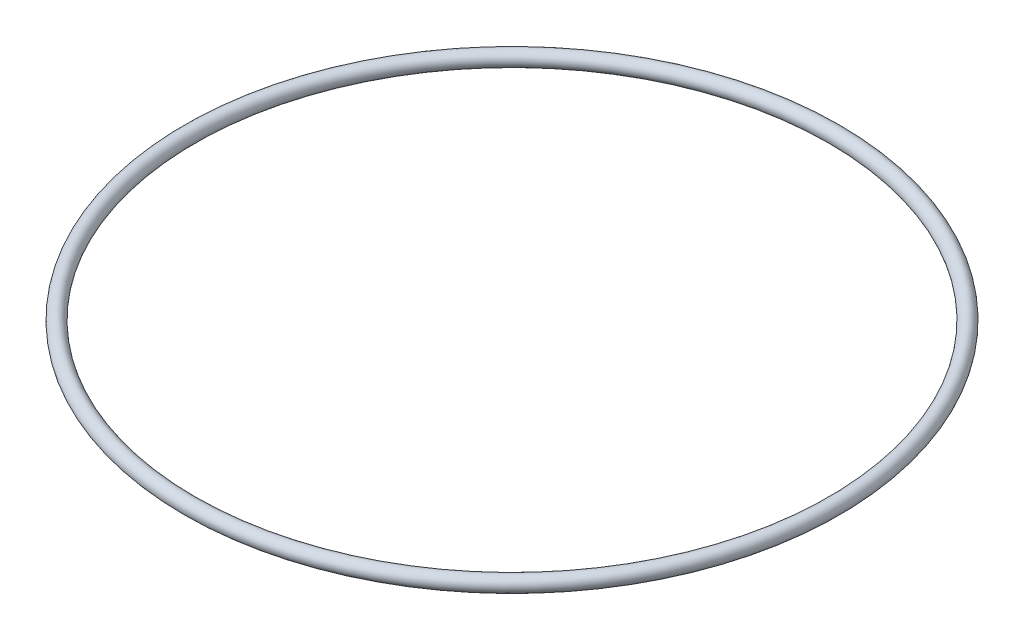
ISO-10303-21;
HEADER;
FILE_DESCRIPTION(('STEP AP214'),'2;1');
FILE_NAME('part.step','',(''),(''),'','','');
FILE_SCHEMA(('AUTOMOTIVE_DESIGN { 1 0 10303 214 1 1 1 1 }'));
ENDSEC;
DATA;
#1=APPLICATION_CONTEXT('core data for automotive mechanical design processes');
#2=APPLICATION_PROTOCOL_DEFINITION('international standard','automotive_design',2000,#1);
#3=PRODUCT_CONTEXT('',#1,'mechanical');
#4=PRODUCT('Part','Part','',(#3));
#5=PRODUCT_RELATED_PRODUCT_CATEGORY('part','',(#4));
#6=PRODUCT_DEFINITION_FORMATION('','',#4);
#7=PRODUCT_DEFINITION_CONTEXT('part definition',#1,'design');
#8=PRODUCT_DEFINITION('design','',#6,#7);
#9=PRODUCT_DEFINITION_SHAPE('','',#8);
#10=(LENGTH_UNIT() NAMED_UNIT(*) SI_UNIT(.MILLI.,.METRE.));
#11=(NAMED_UNIT(*) PLANE_ANGLE_UNIT() SI_UNIT($,.RADIAN.));
#12=(NAMED_UNIT(*) SI_UNIT($,.STERADIAN.) SOLID_ANGLE_UNIT());
#13=UNCERTAINTY_MEASURE_WITH_UNIT(LENGTH_MEASURE(1.E-05),#10,'distance_accuracy_value','');
#14=(GEOMETRIC_REPRESENTATION_CONTEXT(3) GLOBAL_UNCERTAINTY_ASSIGNED_CONTEXT((#13)) GLOBAL_UNIT_ASSIGNED_CONTEXT((#10,
#11,#12)) REPRESENTATION_CONTEXT('',''));
#15=CARTESIAN_POINT('',(0.,0.,0.));
#16=DIRECTION('',(0.,0.,1.));
#17=DIRECTION('',(1.,0.,0.));
#18=AXIS2_PLACEMENT_3D('',#15,#16,#17);
#19=CARTESIAN_POINT('',(0.,0.,0.));
#20=DIRECTION('',(0.,-1.,0.));
#21=DIRECTION('',(0.,0.,-1.));
#22=AXIS2_PLACEMENT_3D('',#19,#20,#21);
#23=TOROIDAL_SURFACE('',#22,45.375,1.05);
#24=CARTESIAN_POINT('',(0.,0.,-46.425));
#25=VERTEX_POINT('',#24);
#26=VERTEX_LOOP('',#25);
#27=FACE_BOUND('',#26,.T.);
#28=ADVANCED_FACE('F33',(#27),#23,.T.);
#29=CLOSED_SHELL('',(#28));
#30=MANIFOLD_SOLID_BREP('B2',#29);
#31=ADVANCED_BREP_SHAPE_REPRESENTATION('',(#18,#30),#14);
#32=SHAPE_DEFINITION_REPRESENTATION(#9,#31);
ENDSEC;
END-ISO-10303-21;
